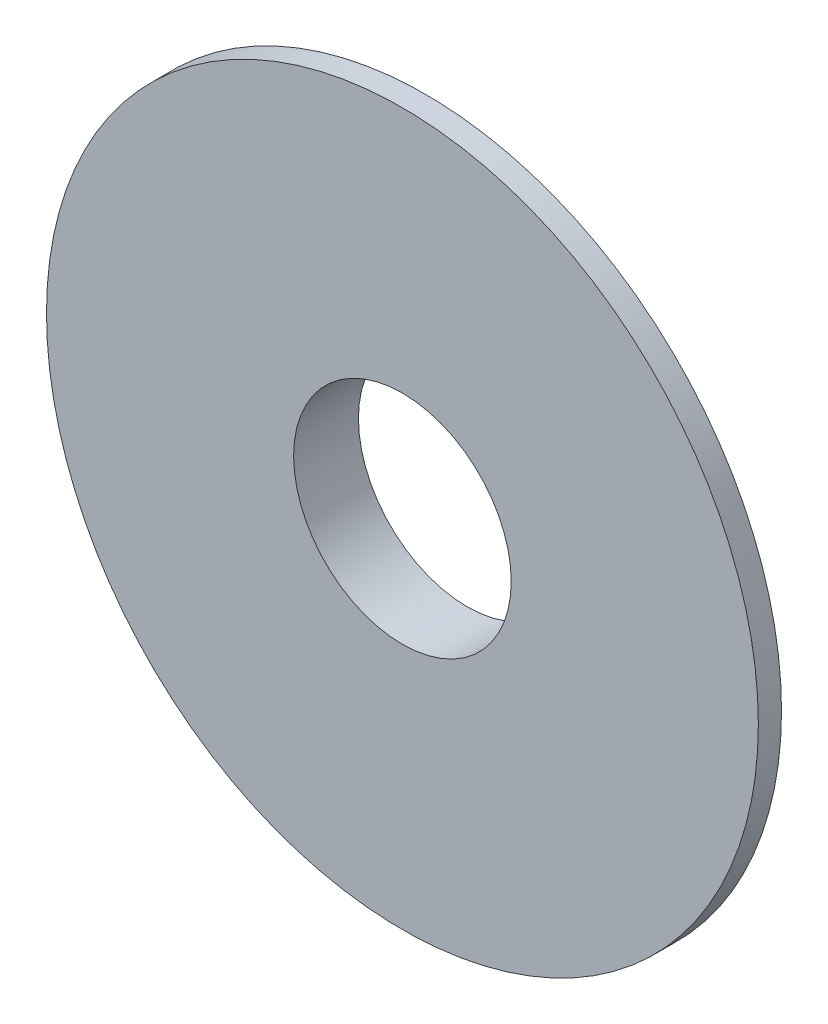
ISO-10303-21;
HEADER;
FILE_DESCRIPTION(('STEP AP214'),'2;1');
FILE_NAME('part.step','',(''),(''),'','','');
FILE_SCHEMA(('AUTOMOTIVE_DESIGN { 1 0 10303 214 1 1 1 1 }'));
ENDSEC;
DATA;
#1=APPLICATION_CONTEXT('core data for automotive mechanical design processes');
#2=APPLICATION_PROTOCOL_DEFINITION('international standard','automotive_design',2000,#1);
#3=PRODUCT_CONTEXT('',#1,'mechanical');
#4=PRODUCT('Part','Part','',(#3));
#5=PRODUCT_RELATED_PRODUCT_CATEGORY('part','',(#4));
#6=PRODUCT_DEFINITION_FORMATION('','',#4);
#7=PRODUCT_DEFINITION_CONTEXT('part definition',#1,'design');
#8=PRODUCT_DEFINITION('design','',#6,#7);
#9=PRODUCT_DEFINITION_SHAPE('','',#8);
#10=(LENGTH_UNIT() NAMED_UNIT(*) SI_UNIT(.MILLI.,.METRE.));
#11=(NAMED_UNIT(*) PLANE_ANGLE_UNIT() SI_UNIT($,.RADIAN.));
#12=(NAMED_UNIT(*) SI_UNIT($,.STERADIAN.) SOLID_ANGLE_UNIT());
#13=UNCERTAINTY_MEASURE_WITH_UNIT(LENGTH_MEASURE(1.E-05),#10,'distance_accuracy_value','');
#14=(GEOMETRIC_REPRESENTATION_CONTEXT(3) GLOBAL_UNCERTAINTY_ASSIGNED_CONTEXT((#13)) GLOBAL_UNIT_ASSIGNED_CONTEXT((#10,
#11,#12)) REPRESENTATION_CONTEXT('',''));
#15=CARTESIAN_POINT('',(0.,0.,0.));
#16=DIRECTION('',(0.,0.,1.));
#17=DIRECTION('',(1.,0.,0.));
#18=AXIS2_PLACEMENT_3D('',#15,#16,#17);
#19=CARTESIAN_POINT('',(0.,0.,35.));
#20=DIRECTION('',(0.,0.,1.));
#21=DIRECTION('',(1.,0.,0.));
#22=AXIS2_PLACEMENT_3D('',#19,#20,#21);
#23=PLANE('',#22);
#24=CARTESIAN_POINT('',(0.,0.,35.));
#25=DIRECTION('',(0.,0.,1.));
#26=DIRECTION('',(1.,0.,0.));
#27=AXIS2_PLACEMENT_3D('',#24,#25,#26);
#28=CIRCLE('',#27,76.8769230769231);
#29=CARTESIAN_POINT('',(76.8769230769231,0.,35.));
#30=VERTEX_POINT('',#29);
#31=EDGE_CURVE('E46',#30,#30,#28,.T.);
#32=ORIENTED_EDGE('',*,*,#31,.F.);
#33=EDGE_LOOP('',(#32));
#34=FACE_BOUND('',#33,.T.);
#35=CARTESIAN_POINT('',(0.,0.,35.));
#36=DIRECTION('',(0.,0.,1.));
#37=DIRECTION('',(1.,0.,0.));
#38=AXIS2_PLACEMENT_3D('',#35,#36,#37);
#39=CIRCLE('',#38,27.5);
#40=CARTESIAN_POINT('',(27.5,0.,35.));
#41=VERTEX_POINT('',#40);
#42=EDGE_CURVE('E10',#41,#41,#39,.F.);
#43=ORIENTED_EDGE('',*,*,#42,.F.);
#44=EDGE_LOOP('',(#43));
#45=FACE_BOUND('',#44,.T.);
#46=ADVANCED_FACE('F35',(#34,#45),#23,.F.);
#47=CARTESIAN_POINT('',(0.,0.,40.));
#48=DIRECTION('',(0.,0.,1.));
#49=DIRECTION('',(1.,0.,0.));
#50=AXIS2_PLACEMENT_3D('',#47,#48,#49);
#51=PLANE('',#50);
#52=CARTESIAN_POINT('',(0.,0.,40.));
#53=DIRECTION('',(0.,0.,1.));
#54=DIRECTION('',(1.,0.,0.));
#55=AXIS2_PLACEMENT_3D('',#52,#53,#54);
#56=CIRCLE('',#55,23.5);
#57=CARTESIAN_POINT('',(23.5,0.,40.));
#58=VERTEX_POINT('',#57);
#59=EDGE_CURVE('E51',#58,#58,#56,.T.);
#60=ORIENTED_EDGE('',*,*,#59,.F.);
#61=EDGE_LOOP('',(#60));
#62=FACE_BOUND('',#61,.T.);
#63=CARTESIAN_POINT('',(0.,0.,40.));
#64=DIRECTION('',(0.,0.,1.));
#65=DIRECTION('',(1.,0.,0.));
#66=AXIS2_PLACEMENT_3D('',#63,#64,#65);
#67=CIRCLE('',#66,76.8769230769231);
#68=CARTESIAN_POINT('',(76.8769230769231,0.,40.));
#69=VERTEX_POINT('',#68);
#70=EDGE_CURVE('E42',#69,#69,#67,.T.);
#71=ORIENTED_EDGE('',*,*,#70,.T.);
#72=EDGE_LOOP('',(#71));
#73=FACE_BOUND('',#72,.T.);
#74=ADVANCED_FACE('F75',(#62,#73),#51,.T.);
#75=CARTESIAN_POINT('',(0.,0.,40.));
#76=DIRECTION('',(0.,0.,-1.));
#77=DIRECTION('',(-1.,0.,0.));
#78=AXIS2_PLACEMENT_3D('',#75,#76,#77);
#79=CYLINDRICAL_SURFACE('',#78,76.8769230769231);
#80=ORIENTED_EDGE('',*,*,#70,.F.);
#81=EDGE_LOOP('',(#80));
#82=FACE_BOUND('',#81,.T.);
#83=ORIENTED_EDGE('',*,*,#31,.T.);
#84=EDGE_LOOP('',(#83));
#85=FACE_BOUND('',#84,.T.);
#86=ADVANCED_FACE('F37',(#82,#85),#79,.T.);
#87=CARTESIAN_POINT('',(0.,0.,40.));
#88=DIRECTION('',(0.,0.,-1.));
#89=DIRECTION('',(-1.,0.,0.));
#90=AXIS2_PLACEMENT_3D('',#87,#88,#89);
#91=CYLINDRICAL_SURFACE('',#90,23.5);
#92=ORIENTED_EDGE('',*,*,#59,.T.);
#93=EDGE_LOOP('',(#92));
#94=FACE_BOUND('',#93,.T.);
#95=CARTESIAN_POINT('',(0.,0.,26.));
#96=DIRECTION('',(0.,0.,1.));
#97=DIRECTION('',(1.,0.,0.));
#98=AXIS2_PLACEMENT_3D('',#95,#96,#97);
#99=CIRCLE('',#98,23.5);
#100=CARTESIAN_POINT('',(23.5,0.,26.));
#101=VERTEX_POINT('',#100);
#102=EDGE_CURVE('E58',#101,#101,#99,.T.);
#103=ORIENTED_EDGE('',*,*,#102,.F.);
#104=EDGE_LOOP('',(#103));
#105=FACE_BOUND('',#104,.T.);
#106=ADVANCED_FACE('F64',(#94,#105),#91,.F.);
#107=CARTESIAN_POINT('',(0.,0.,40.));
#108=DIRECTION('',(0.,0.,-1.));
#109=DIRECTION('',(-1.,0.,0.));
#110=AXIS2_PLACEMENT_3D('',#107,#108,#109);
#111=CYLINDRICAL_SURFACE('',#110,27.5);
#112=CARTESIAN_POINT('',(0.,0.,26.));
#113=DIRECTION('',(0.,0.,1.));
#114=DIRECTION('',(1.,0.,0.));
#115=AXIS2_PLACEMENT_3D('',#112,#113,#114);
#116=CIRCLE('',#115,27.5);
#117=CARTESIAN_POINT('',(27.5,0.,26.));
#118=VERTEX_POINT('',#117);
#119=EDGE_CURVE('E55',#118,#118,#116,.T.);
#120=ORIENTED_EDGE('',*,*,#119,.T.);
#121=EDGE_LOOP('',(#120));
#122=FACE_BOUND('',#121,.T.);
#123=ORIENTED_EDGE('',*,*,#42,.T.);
#124=EDGE_LOOP('',(#123));
#125=FACE_BOUND('',#124,.T.);
#126=ADVANCED_FACE('F66',(#122,#125),#111,.T.);
#127=CARTESIAN_POINT('',(0.,0.,26.));
#128=DIRECTION('',(0.,0.,1.));
#129=DIRECTION('',(1.,0.,0.));
#130=AXIS2_PLACEMENT_3D('',#127,#128,#129);
#131=PLANE('',#130);
#132=ORIENTED_EDGE('',*,*,#119,.F.);
#133=EDGE_LOOP('',(#132));
#134=FACE_BOUND('',#133,.T.);
#135=ORIENTED_EDGE('',*,*,#102,.T.);
#136=EDGE_LOOP('',(#135));
#137=FACE_BOUND('',#136,.T.);
#138=ADVANCED_FACE('F62',(#134,#137),#131,.F.);
#139=CLOSED_SHELL('',(#46,#74,#86,#106,#126,#138));
#140=MANIFOLD_SOLID_BREP('B2',#139);
#141=ADVANCED_BREP_SHAPE_REPRESENTATION('',(#18,#140),#14);
#142=SHAPE_DEFINITION_REPRESENTATION(#9,#141);
ENDSEC;
END-ISO-10303-21;
